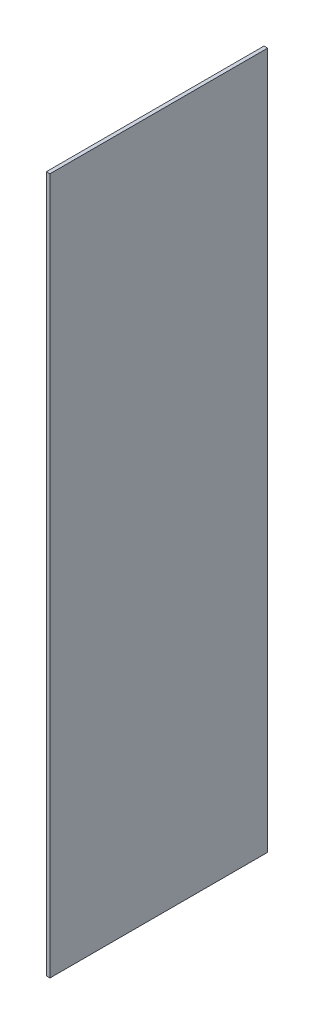
ISO-10303-21;
HEADER;
FILE_DESCRIPTION(('STEP AP214'),'2;1');
FILE_NAME('part.step','',(''),(''),'','','');
FILE_SCHEMA(('AUTOMOTIVE_DESIGN { 1 0 10303 214 1 1 1 1 }'));
ENDSEC;
DATA;
#1=APPLICATION_CONTEXT('core data for automotive mechanical design processes');
#2=APPLICATION_PROTOCOL_DEFINITION('international standard','automotive_design',2000,#1);
#3=PRODUCT_CONTEXT('',#1,'mechanical');
#4=PRODUCT('Part','Part','',(#3));
#5=PRODUCT_RELATED_PRODUCT_CATEGORY('part','',(#4));
#6=PRODUCT_DEFINITION_FORMATION('','',#4);
#7=PRODUCT_DEFINITION_CONTEXT('part definition',#1,'design');
#8=PRODUCT_DEFINITION('design','',#6,#7);
#9=PRODUCT_DEFINITION_SHAPE('','',#8);
#10=(LENGTH_UNIT() NAMED_UNIT(*) SI_UNIT(.MILLI.,.METRE.));
#11=(NAMED_UNIT(*) PLANE_ANGLE_UNIT() SI_UNIT($,.RADIAN.));
#12=(NAMED_UNIT(*) SI_UNIT($,.STERADIAN.) SOLID_ANGLE_UNIT());
#13=UNCERTAINTY_MEASURE_WITH_UNIT(LENGTH_MEASURE(1.E-05),#10,'distance_accuracy_value','');
#14=(GEOMETRIC_REPRESENTATION_CONTEXT(3) GLOBAL_UNCERTAINTY_ASSIGNED_CONTEXT((#13)) GLOBAL_UNIT_ASSIGNED_CONTEXT((#10,
#11,#12)) REPRESENTATION_CONTEXT('',''));
#15=CARTESIAN_POINT('',(0.,0.,0.));
#16=DIRECTION('',(0.,0.,1.));
#17=DIRECTION('',(1.,0.,0.));
#18=AXIS2_PLACEMENT_3D('',#15,#16,#17);
#19=CARTESIAN_POINT('',(6.35,2438.4,381.));
#20=DIRECTION('',(-1.,0.,0.));
#21=DIRECTION('',(0.,0.,1.));
#22=AXIS2_PLACEMENT_3D('',#19,#20,#21);
#23=PLANE('',#22);
#24=DIRECTION('',(0.,0.,-1.));
#25=VECTOR('',#24,1.);
#26=CARTESIAN_POINT('',(6.35,0.,381.));
#27=LINE('',#26,#25);
#28=CARTESIAN_POINT('',(6.35,0.,381.));
#29=VERTEX_POINT('',#28);
#30=CARTESIAN_POINT('',(6.35,0.,-381.));
#31=VERTEX_POINT('',#30);
#32=EDGE_CURVE('E106',#29,#31,#27,.T.);
#33=ORIENTED_EDGE('',*,*,#32,.T.);
#34=DIRECTION('',(0.,-1.,0.));
#35=VECTOR('',#34,1.);
#36=CARTESIAN_POINT('',(6.35,2438.4,-381.));
#37=LINE('',#36,#35);
#38=CARTESIAN_POINT('',(6.35,2438.4,-381.));
#39=VERTEX_POINT('',#38);
#40=EDGE_CURVE('E11',#39,#31,#37,.T.);
#41=ORIENTED_EDGE('',*,*,#40,.F.);
#42=DIRECTION('',(0.,0.,-1.));
#43=VECTOR('',#42,1.);
#44=CARTESIAN_POINT('',(6.35,2438.4,381.));
#45=LINE('',#44,#43);
#46=CARTESIAN_POINT('',(6.35,2438.4,381.));
#47=VERTEX_POINT('',#46);
#48=EDGE_CURVE('E90',#47,#39,#45,.T.);
#49=ORIENTED_EDGE('',*,*,#48,.F.);
#50=DIRECTION('',(0.,-1.,0.));
#51=VECTOR('',#50,1.);
#52=CARTESIAN_POINT('',(6.35,2438.4,381.));
#53=LINE('',#52,#51);
#54=EDGE_CURVE('E102',#47,#29,#53,.T.);
#55=ORIENTED_EDGE('',*,*,#54,.T.);
#56=EDGE_LOOP('',(#33,#41,#49,#55));
#57=FACE_BOUND('',#56,.T.);
#58=ADVANCED_FACE('F38',(#57),#23,.F.);
#59=CARTESIAN_POINT('',(-6.35,2438.4,-381.));
#60=DIRECTION('',(0.,0.,1.));
#61=DIRECTION('',(1.,0.,0.));
#62=AXIS2_PLACEMENT_3D('',#59,#60,#61);
#63=PLANE('',#62);
#64=DIRECTION('',(-1.,0.,0.));
#65=VECTOR('',#64,1.);
#66=CARTESIAN_POINT('',(-6.35,0.,-381.));
#67=LINE('',#66,#65);
#68=CARTESIAN_POINT('',(-6.35,0.,-381.));
#69=VERTEX_POINT('',#68);
#70=EDGE_CURVE('E95',#31,#69,#67,.T.);
#71=ORIENTED_EDGE('',*,*,#70,.T.);
#72=DIRECTION('',(0.,-1.,0.));
#73=VECTOR('',#72,1.);
#74=CARTESIAN_POINT('',(-6.35,2438.4,-381.));
#75=LINE('',#74,#73);
#76=CARTESIAN_POINT('',(-6.35,2438.4,-381.));
#77=VERTEX_POINT('',#76);
#78=EDGE_CURVE('E47',#77,#69,#75,.T.);
#79=ORIENTED_EDGE('',*,*,#78,.F.);
#80=DIRECTION('',(-1.,0.,0.));
#81=VECTOR('',#80,1.);
#82=CARTESIAN_POINT('',(-6.35,2438.4,-381.));
#83=LINE('',#82,#81);
#84=EDGE_CURVE('E85',#39,#77,#83,.T.);
#85=ORIENTED_EDGE('',*,*,#84,.F.);
#86=ORIENTED_EDGE('',*,*,#40,.T.);
#87=EDGE_LOOP('',(#71,#79,#85,#86));
#88=FACE_BOUND('',#87,.T.);
#89=ADVANCED_FACE('F94',(#88),#63,.F.);
#90=CARTESIAN_POINT('',(-6.35,2438.4,381.));
#91=DIRECTION('',(1.,0.,0.));
#92=DIRECTION('',(0.,0.,-1.));
#93=AXIS2_PLACEMENT_3D('',#90,#91,#92);
#94=PLANE('',#93);
#95=DIRECTION('',(0.,0.,1.));
#96=VECTOR('',#95,1.);
#97=CARTESIAN_POINT('',(-6.35,0.,381.));
#98=LINE('',#97,#96);
#99=CARTESIAN_POINT('',(-6.35,0.,381.));
#100=VERTEX_POINT('',#99);
#101=EDGE_CURVE('E72',#69,#100,#98,.T.);
#102=ORIENTED_EDGE('',*,*,#101,.T.);
#103=DIRECTION('',(0.,-1.,0.));
#104=VECTOR('',#103,1.);
#105=CARTESIAN_POINT('',(-6.35,2438.4,381.));
#106=LINE('',#105,#104);
#107=CARTESIAN_POINT('',(-6.35,2438.4,381.));
#108=VERTEX_POINT('',#107);
#109=EDGE_CURVE('E97',#108,#100,#106,.T.);
#110=ORIENTED_EDGE('',*,*,#109,.F.);
#111=DIRECTION('',(0.,0.,1.));
#112=VECTOR('',#111,1.);
#113=CARTESIAN_POINT('',(-6.35,2438.4,381.));
#114=LINE('',#113,#112);
#115=EDGE_CURVE('E88',#77,#108,#114,.T.);
#116=ORIENTED_EDGE('',*,*,#115,.F.);
#117=ORIENTED_EDGE('',*,*,#78,.T.);
#118=EDGE_LOOP('',(#102,#110,#116,#117));
#119=FACE_BOUND('',#118,.T.);
#120=ADVANCED_FACE('F98',(#119),#94,.F.);
#121=CARTESIAN_POINT('',(-6.35,2438.4,381.));
#122=DIRECTION('',(0.,0.,-1.));
#123=DIRECTION('',(-1.,0.,0.));
#124=AXIS2_PLACEMENT_3D('',#121,#122,#123);
#125=PLANE('',#124);
#126=DIRECTION('',(1.,0.,0.));
#127=VECTOR('',#126,1.);
#128=CARTESIAN_POINT('',(-6.35,0.,381.));
#129=LINE('',#128,#127);
#130=EDGE_CURVE('E78',#100,#29,#129,.T.);
#131=ORIENTED_EDGE('',*,*,#130,.T.);
#132=ORIENTED_EDGE('',*,*,#54,.F.);
#133=DIRECTION('',(1.,0.,0.));
#134=VECTOR('',#133,1.);
#135=CARTESIAN_POINT('',(-6.35,2438.4,381.));
#136=LINE('',#135,#134);
#137=EDGE_CURVE('E55',#108,#47,#136,.T.);
#138=ORIENTED_EDGE('',*,*,#137,.F.);
#139=ORIENTED_EDGE('',*,*,#109,.T.);
#140=EDGE_LOOP('',(#131,#132,#138,#139));
#141=FACE_BOUND('',#140,.T.);
#142=ADVANCED_FACE('F119',(#141),#125,.F.);
#143=CARTESIAN_POINT('',(0.,2438.4,0.));
#144=DIRECTION('',(0.,-1.,0.));
#145=DIRECTION('',(0.,0.,-1.));
#146=AXIS2_PLACEMENT_3D('',#143,#144,#145);
#147=PLANE('',#146);
#148=ORIENTED_EDGE('',*,*,#48,.T.);
#149=ORIENTED_EDGE('',*,*,#84,.T.);
#150=ORIENTED_EDGE('',*,*,#115,.T.);
#151=ORIENTED_EDGE('',*,*,#137,.T.);
#152=EDGE_LOOP('',(#148,#149,#150,#151));
#153=FACE_BOUND('',#152,.T.);
#154=ADVANCED_FACE('F86',(#153),#147,.F.);
#155=CARTESIAN_POINT('',(0.,0.,0.));
#156=DIRECTION('',(0.,-1.,0.));
#157=DIRECTION('',(0.,0.,-1.));
#158=AXIS2_PLACEMENT_3D('',#155,#156,#157);
#159=PLANE('',#158);
#160=ORIENTED_EDGE('',*,*,#32,.F.);
#161=ORIENTED_EDGE('',*,*,#130,.F.);
#162=ORIENTED_EDGE('',*,*,#101,.F.);
#163=ORIENTED_EDGE('',*,*,#70,.F.);
#164=EDGE_LOOP('',(#160,#161,#162,#163));
#165=FACE_BOUND('',#164,.T.);
#166=ADVANCED_FACE('F122',(#165),#159,.T.);
#167=CLOSED_SHELL('',(#58,#89,#120,#142,#154,#166));
#168=MANIFOLD_SOLID_BREP('B2',#167);
#169=ADVANCED_BREP_SHAPE_REPRESENTATION('',(#18,#168),#14);
#170=SHAPE_DEFINITION_REPRESENTATION(#9,#169);
ENDSEC;
END-ISO-10303-21;
